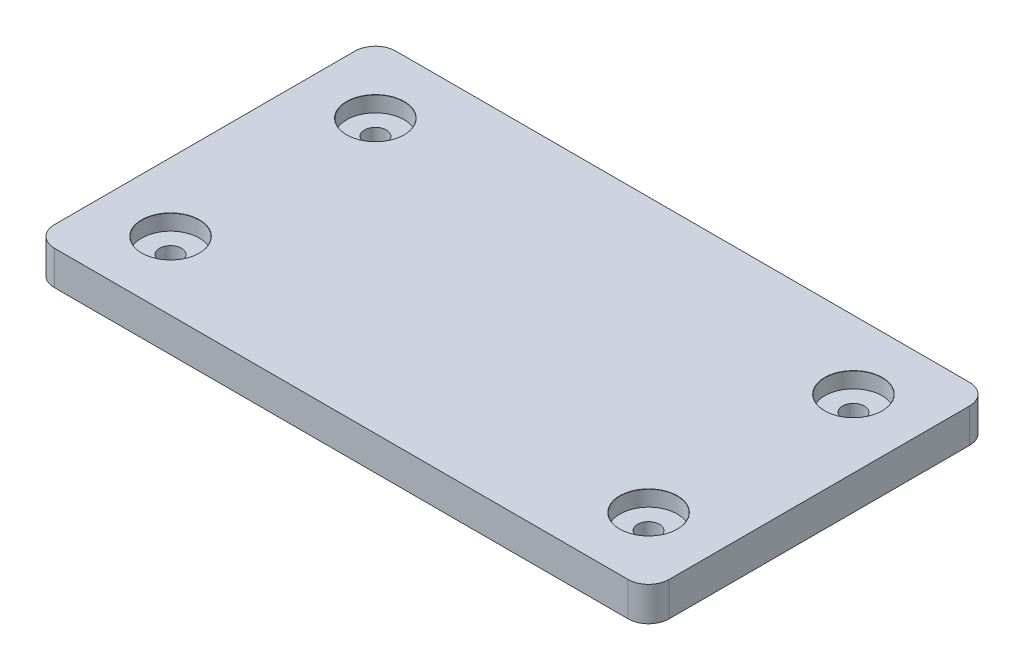
ISO-10303-21;
HEADER;
FILE_DESCRIPTION(('STEP AP214'),'2;1');
FILE_NAME('part.step','',(''),(''),'','','');
FILE_SCHEMA(('AUTOMOTIVE_DESIGN { 1 0 10303 214 1 1 1 1 }'));
ENDSEC;
DATA;
#1=APPLICATION_CONTEXT('core data for automotive mechanical design processes');
#2=APPLICATION_PROTOCOL_DEFINITION('international standard','automotive_design',2000,#1);
#3=PRODUCT_CONTEXT('',#1,'mechanical');
#4=PRODUCT('Part','Part','',(#3));
#5=PRODUCT_RELATED_PRODUCT_CATEGORY('part','',(#4));
#6=PRODUCT_DEFINITION_FORMATION('','',#4);
#7=PRODUCT_DEFINITION_CONTEXT('part definition',#1,'design');
#8=PRODUCT_DEFINITION('design','',#6,#7);
#9=PRODUCT_DEFINITION_SHAPE('','',#8);
#10=(LENGTH_UNIT() NAMED_UNIT(*) SI_UNIT(.MILLI.,.METRE.));
#11=(NAMED_UNIT(*) PLANE_ANGLE_UNIT() SI_UNIT($,.RADIAN.));
#12=(NAMED_UNIT(*) SI_UNIT($,.STERADIAN.) SOLID_ANGLE_UNIT());
#13=UNCERTAINTY_MEASURE_WITH_UNIT(LENGTH_MEASURE(1.E-05),#10,'distance_accuracy_value','');
#14=(GEOMETRIC_REPRESENTATION_CONTEXT(3) GLOBAL_UNCERTAINTY_ASSIGNED_CONTEXT((#13)) GLOBAL_UNIT_ASSIGNED_CONTEXT((#10,
#11,#12)) REPRESENTATION_CONTEXT('',''));
#15=CARTESIAN_POINT('',(0.,0.,0.));
#16=DIRECTION('',(0.,0.,1.));
#17=DIRECTION('',(1.,0.,0.));
#18=AXIS2_PLACEMENT_3D('',#15,#16,#17);
#19=CARTESIAN_POINT('',(0.,0.,0.));
#20=DIRECTION('',(0.,1.,0.));
#21=DIRECTION('',(0.,0.,1.));
#22=AXIS2_PLACEMENT_3D('',#19,#20,#21);
#23=PLANE('',#22);
#24=CARTESIAN_POINT('',(35.,0.,15.));
#25=DIRECTION('',(0.,1.,0.));
#26=DIRECTION('',(0.,0.,1.));
#27=AXIS2_PLACEMENT_3D('',#24,#25,#26);
#28=CIRCLE('',#27,1.6);
#29=CARTESIAN_POINT('',(35.,0.,16.6));
#30=VERTEX_POINT('',#29);
#31=EDGE_CURVE('E219',#30,#30,#28,.F.);
#32=ORIENTED_EDGE('',*,*,#31,.F.);
#33=EDGE_LOOP('',(#32));
#34=FACE_BOUND('',#33,.T.);
#35=CARTESIAN_POINT('',(35.,0.,-15.));
#36=DIRECTION('',(0.,1.,0.));
#37=DIRECTION('',(0.,0.,1.));
#38=AXIS2_PLACEMENT_3D('',#35,#36,#37);
#39=CIRCLE('',#38,1.6);
#40=CARTESIAN_POINT('',(35.,0.,-13.4));
#41=VERTEX_POINT('',#40);
#42=EDGE_CURVE('E189',#41,#41,#39,.F.);
#43=ORIENTED_EDGE('',*,*,#42,.F.);
#44=EDGE_LOOP('',(#43));
#45=FACE_BOUND('',#44,.T.);
#46=DIRECTION('',(-1.,0.,0.));
#47=VECTOR('',#46,1.);
#48=CARTESIAN_POINT('',(45.,0.,-25.));
#49=LINE('',#48,#47);
#50=CARTESIAN_POINT('',(42.,0.,-25.));
#51=VERTEX_POINT('',#50);
#52=CARTESIAN_POINT('',(-42.,0.,-25.));
#53=VERTEX_POINT('',#52);
#54=EDGE_CURVE('E124',#51,#53,#49,.T.);
#55=ORIENTED_EDGE('',*,*,#54,.F.);
#56=CARTESIAN_POINT('',(42.,0.,-22.));
#57=DIRECTION('',(0.,1.,0.));
#58=DIRECTION('',(0.,0.,1.));
#59=AXIS2_PLACEMENT_3D('',#56,#57,#58);
#60=CIRCLE('',#59,3.);
#61=CARTESIAN_POINT('',(45.,0.,-22.));
#62=VERTEX_POINT('',#61);
#63=EDGE_CURVE('E106',#51,#62,#60,.F.);
#64=ORIENTED_EDGE('',*,*,#63,.T.);
#65=DIRECTION('',(0.,0.,-1.));
#66=VECTOR('',#65,1.);
#67=CARTESIAN_POINT('',(45.,0.,25.));
#68=LINE('',#67,#66);
#69=CARTESIAN_POINT('',(45.,0.,22.));
#70=VERTEX_POINT('',#69);
#71=EDGE_CURVE('E136',#70,#62,#68,.T.);
#72=ORIENTED_EDGE('',*,*,#71,.F.);
#73=CARTESIAN_POINT('',(42.,0.,22.));
#74=DIRECTION('',(0.,1.,0.));
#75=DIRECTION('',(0.,0.,1.));
#76=AXIS2_PLACEMENT_3D('',#73,#74,#75);
#77=CIRCLE('',#76,3.);
#78=CARTESIAN_POINT('',(42.,0.,25.));
#79=VERTEX_POINT('',#78);
#80=EDGE_CURVE('E118',#70,#79,#77,.F.);
#81=ORIENTED_EDGE('',*,*,#80,.T.);
#82=DIRECTION('',(1.,0.,0.));
#83=VECTOR('',#82,1.);
#84=CARTESIAN_POINT('',(45.,0.,25.));
#85=LINE('',#84,#83);
#86=CARTESIAN_POINT('',(-42.,0.,25.));
#87=VERTEX_POINT('',#86);
#88=EDGE_CURVE('E142',#87,#79,#85,.T.);
#89=ORIENTED_EDGE('',*,*,#88,.F.);
#90=CARTESIAN_POINT('',(-42.,0.,22.));
#91=DIRECTION('',(0.,1.,0.));
#92=DIRECTION('',(0.,0.,1.));
#93=AXIS2_PLACEMENT_3D('',#90,#91,#92);
#94=CIRCLE('',#93,3.);
#95=CARTESIAN_POINT('',(-45.,0.,22.));
#96=VERTEX_POINT('',#95);
#97=EDGE_CURVE('E150',#87,#96,#94,.F.);
#98=ORIENTED_EDGE('',*,*,#97,.T.);
#99=DIRECTION('',(0.,0.,1.));
#100=VECTOR('',#99,1.);
#101=CARTESIAN_POINT('',(-45.,0.,25.));
#102=LINE('',#101,#100);
#103=CARTESIAN_POINT('',(-45.,0.,-22.));
#104=VERTEX_POINT('',#103);
#105=EDGE_CURVE('E183',#104,#96,#102,.T.);
#106=ORIENTED_EDGE('',*,*,#105,.F.);
#107=CARTESIAN_POINT('',(-42.,0.,-22.));
#108=DIRECTION('',(0.,1.,0.));
#109=DIRECTION('',(0.,0.,1.));
#110=AXIS2_PLACEMENT_3D('',#107,#108,#109);
#111=CIRCLE('',#110,3.);
#112=EDGE_CURVE('E129',#104,#53,#111,.F.);
#113=ORIENTED_EDGE('',*,*,#112,.T.);
#114=EDGE_LOOP('',(#55,#64,#72,#81,#89,#98,#106,#113));
#115=FACE_BOUND('',#114,.T.);
#116=CARTESIAN_POINT('',(-35.,0.,15.));
#117=DIRECTION('',(0.,1.,0.));
#118=DIRECTION('',(0.,0.,1.));
#119=AXIS2_PLACEMENT_3D('',#116,#117,#118);
#120=CIRCLE('',#119,1.6);
#121=CARTESIAN_POINT('',(-35.,0.,16.6));
#122=VERTEX_POINT('',#121);
#123=EDGE_CURVE('E237',#122,#122,#120,.F.);
#124=ORIENTED_EDGE('',*,*,#123,.F.);
#125=EDGE_LOOP('',(#124));
#126=FACE_BOUND('',#125,.T.);
#127=CARTESIAN_POINT('',(-35.,0.,-15.));
#128=DIRECTION('',(0.,1.,0.));
#129=DIRECTION('',(0.,0.,1.));
#130=AXIS2_PLACEMENT_3D('',#127,#128,#129);
#131=CIRCLE('',#130,1.6);
#132=CARTESIAN_POINT('',(-35.,0.,-13.4));
#133=VERTEX_POINT('',#132);
#134=EDGE_CURVE('E257',#133,#133,#131,.F.);
#135=ORIENTED_EDGE('',*,*,#134,.F.);
#136=EDGE_LOOP('',(#135));
#137=FACE_BOUND('',#136,.T.);
#138=ADVANCED_FACE('F39',(#34,#45,#115,#126,#137),#23,.F.);
#139=CARTESIAN_POINT('',(-45.,5.,25.));
#140=DIRECTION('',(1.,0.,0.));
#141=DIRECTION('',(0.,0.,-1.));
#142=AXIS2_PLACEMENT_3D('',#139,#140,#141);
#143=PLANE('',#142);
#144=ORIENTED_EDGE('',*,*,#105,.T.);
#145=DIRECTION('',(0.,-1.,0.));
#146=VECTOR('',#145,1.);
#147=CARTESIAN_POINT('',(-45.,5.,22.));
#148=LINE('',#147,#146);
#149=CARTESIAN_POINT('',(-45.,5.,22.));
#150=VERTEX_POINT('',#149);
#151=EDGE_CURVE('E11',#96,#150,#148,.F.);
#152=ORIENTED_EDGE('',*,*,#151,.T.);
#153=DIRECTION('',(0.,0.,1.));
#154=VECTOR('',#153,1.);
#155=CARTESIAN_POINT('',(-45.,5.,25.));
#156=LINE('',#155,#154);
#157=CARTESIAN_POINT('',(-45.,5.,-22.));
#158=VERTEX_POINT('',#157);
#159=EDGE_CURVE('E135',#158,#150,#156,.T.);
#160=ORIENTED_EDGE('',*,*,#159,.F.);
#161=DIRECTION('',(0.,-1.,0.));
#162=VECTOR('',#161,1.);
#163=CARTESIAN_POINT('',(-45.,5.,-22.));
#164=LINE('',#163,#162);
#165=EDGE_CURVE('E48',#158,#104,#164,.T.);
#166=ORIENTED_EDGE('',*,*,#165,.T.);
#167=EDGE_LOOP('',(#144,#152,#160,#166));
#168=FACE_BOUND('',#167,.T.);
#169=ADVANCED_FACE('F182',(#168),#143,.F.);
#170=CARTESIAN_POINT('',(45.,5.,25.));
#171=DIRECTION('',(0.,0.,-1.));
#172=DIRECTION('',(-1.,0.,0.));
#173=AXIS2_PLACEMENT_3D('',#170,#171,#172);
#174=PLANE('',#173);
#175=ORIENTED_EDGE('',*,*,#88,.T.);
#176=DIRECTION('',(0.,-1.,0.));
#177=VECTOR('',#176,1.);
#178=CARTESIAN_POINT('',(42.,5.,25.));
#179=LINE('',#178,#177);
#180=CARTESIAN_POINT('',(42.,5.,25.));
#181=VERTEX_POINT('',#180);
#182=EDGE_CURVE('E55',#79,#181,#179,.F.);
#183=ORIENTED_EDGE('',*,*,#182,.T.);
#184=DIRECTION('',(1.,0.,0.));
#185=VECTOR('',#184,1.);
#186=CARTESIAN_POINT('',(45.,5.,25.));
#187=LINE('',#186,#185);
#188=CARTESIAN_POINT('',(-42.,5.,25.));
#189=VERTEX_POINT('',#188);
#190=EDGE_CURVE('E140',#189,#181,#187,.T.);
#191=ORIENTED_EDGE('',*,*,#190,.F.);
#192=DIRECTION('',(0.,-1.,0.));
#193=VECTOR('',#192,1.);
#194=CARTESIAN_POINT('',(-42.,5.,25.));
#195=LINE('',#194,#193);
#196=EDGE_CURVE('E171',#189,#87,#195,.T.);
#197=ORIENTED_EDGE('',*,*,#196,.T.);
#198=EDGE_LOOP('',(#175,#183,#191,#197));
#199=FACE_BOUND('',#198,.T.);
#200=ADVANCED_FACE('F290',(#199),#174,.F.);
#201=CARTESIAN_POINT('',(45.,5.,25.));
#202=DIRECTION('',(-1.,0.,0.));
#203=DIRECTION('',(0.,0.,1.));
#204=AXIS2_PLACEMENT_3D('',#201,#202,#203);
#205=PLANE('',#204);
#206=ORIENTED_EDGE('',*,*,#71,.T.);
#207=DIRECTION('',(0.,-1.,0.));
#208=VECTOR('',#207,1.);
#209=CARTESIAN_POINT('',(45.,5.,-22.));
#210=LINE('',#209,#208);
#211=CARTESIAN_POINT('',(45.,5.,-22.));
#212=VERTEX_POINT('',#211);
#213=EDGE_CURVE('E111',#62,#212,#210,.F.);
#214=ORIENTED_EDGE('',*,*,#213,.T.);
#215=DIRECTION('',(0.,0.,-1.));
#216=VECTOR('',#215,1.);
#217=CARTESIAN_POINT('',(45.,5.,25.));
#218=LINE('',#217,#216);
#219=CARTESIAN_POINT('',(45.,5.,22.));
#220=VERTEX_POINT('',#219);
#221=EDGE_CURVE('E199',#220,#212,#218,.T.);
#222=ORIENTED_EDGE('',*,*,#221,.F.);
#223=DIRECTION('',(0.,-1.,0.));
#224=VECTOR('',#223,1.);
#225=CARTESIAN_POINT('',(45.,5.,22.));
#226=LINE('',#225,#224);
#227=EDGE_CURVE('E117',#220,#70,#226,.T.);
#228=ORIENTED_EDGE('',*,*,#227,.T.);
#229=EDGE_LOOP('',(#206,#214,#222,#228));
#230=FACE_BOUND('',#229,.T.);
#231=ADVANCED_FACE('F300',(#230),#205,.F.);
#232=CARTESIAN_POINT('',(45.,5.,-25.));
#233=DIRECTION('',(0.,0.,1.));
#234=DIRECTION('',(1.,0.,0.));
#235=AXIS2_PLACEMENT_3D('',#232,#233,#234);
#236=PLANE('',#235);
#237=DIRECTION('',(-1.,0.,0.));
#238=VECTOR('',#237,1.);
#239=CARTESIAN_POINT('',(45.,5.,-25.));
#240=LINE('',#239,#238);
#241=CARTESIAN_POINT('',(42.,5.,-25.));
#242=VERTEX_POINT('',#241);
#243=CARTESIAN_POINT('',(-42.,5.,-25.));
#244=VERTEX_POINT('',#243);
#245=EDGE_CURVE('E127',#242,#244,#240,.T.);
#246=ORIENTED_EDGE('',*,*,#245,.F.);
#247=DIRECTION('',(0.,-1.,0.));
#248=VECTOR('',#247,1.);
#249=CARTESIAN_POINT('',(42.,5.,-25.));
#250=LINE('',#249,#248);
#251=EDGE_CURVE('E110',#242,#51,#250,.T.);
#252=ORIENTED_EDGE('',*,*,#251,.T.);
#253=ORIENTED_EDGE('',*,*,#54,.T.);
#254=DIRECTION('',(0.,-1.,0.));
#255=VECTOR('',#254,1.);
#256=CARTESIAN_POINT('',(-42.,5.,-25.));
#257=LINE('',#256,#255);
#258=EDGE_CURVE('E130',#53,#244,#257,.F.);
#259=ORIENTED_EDGE('',*,*,#258,.T.);
#260=EDGE_LOOP('',(#246,#252,#253,#259));
#261=FACE_BOUND('',#260,.T.);
#262=ADVANCED_FACE('F123',(#261),#236,.F.);
#263=CARTESIAN_POINT('',(0.,5.,0.));
#264=DIRECTION('',(0.,1.,0.));
#265=DIRECTION('',(0.,0.,1.));
#266=AXIS2_PLACEMENT_3D('',#263,#264,#265);
#267=PLANE('',#266);
#268=CARTESIAN_POINT('',(-35.,5.,-15.));
#269=DIRECTION('',(0.,1.,0.));
#270=DIRECTION('',(0.,0.,1.));
#271=AXIS2_PLACEMENT_3D('',#268,#269,#270);
#272=CIRCLE('',#271,4.225);
#273=CARTESIAN_POINT('',(-35.,5.,-10.775));
#274=VERTEX_POINT('',#273);
#275=EDGE_CURVE('E273',#274,#274,#272,.T.);
#276=ORIENTED_EDGE('',*,*,#275,.F.);
#277=EDGE_LOOP('',(#276));
#278=FACE_BOUND('',#277,.T.);
#279=CARTESIAN_POINT('',(-35.,5.,15.));
#280=DIRECTION('',(0.,1.,0.));
#281=DIRECTION('',(0.,0.,1.));
#282=AXIS2_PLACEMENT_3D('',#279,#280,#281);
#283=CIRCLE('',#282,4.225);
#284=CARTESIAN_POINT('',(-35.,5.,19.225));
#285=VERTEX_POINT('',#284);
#286=EDGE_CURVE('E253',#285,#285,#283,.T.);
#287=ORIENTED_EDGE('',*,*,#286,.F.);
#288=EDGE_LOOP('',(#287));
#289=FACE_BOUND('',#288,.T.);
#290=CARTESIAN_POINT('',(35.,5.,15.));
#291=DIRECTION('',(0.,1.,0.));
#292=DIRECTION('',(0.,0.,1.));
#293=AXIS2_PLACEMENT_3D('',#290,#291,#292);
#294=CIRCLE('',#293,4.225);
#295=CARTESIAN_POINT('',(35.,5.,19.225));
#296=VERTEX_POINT('',#295);
#297=EDGE_CURVE('E233',#296,#296,#294,.T.);
#298=ORIENTED_EDGE('',*,*,#297,.F.);
#299=EDGE_LOOP('',(#298));
#300=FACE_BOUND('',#299,.T.);
#301=CARTESIAN_POINT('',(35.,5.,-15.));
#302=DIRECTION('',(0.,1.,0.));
#303=DIRECTION('',(0.,0.,1.));
#304=AXIS2_PLACEMENT_3D('',#301,#302,#303);
#305=CIRCLE('',#304,4.225);
#306=CARTESIAN_POINT('',(35.,5.,-10.775));
#307=VERTEX_POINT('',#306);
#308=EDGE_CURVE('E216',#307,#307,#305,.T.);
#309=ORIENTED_EDGE('',*,*,#308,.F.);
#310=EDGE_LOOP('',(#309));
#311=FACE_BOUND('',#310,.T.);
#312=ORIENTED_EDGE('',*,*,#221,.T.);
#313=CARTESIAN_POINT('',(42.,5.,-22.));
#314=DIRECTION('',(0.,1.,0.));
#315=DIRECTION('',(0.,0.,1.));
#316=AXIS2_PLACEMENT_3D('',#313,#314,#315);
#317=CIRCLE('',#316,3.);
#318=EDGE_CURVE('E168',#212,#242,#317,.T.);
#319=ORIENTED_EDGE('',*,*,#318,.T.);
#320=ORIENTED_EDGE('',*,*,#245,.T.);
#321=CARTESIAN_POINT('',(-42.,5.,-22.));
#322=DIRECTION('',(0.,1.,0.));
#323=DIRECTION('',(0.,0.,1.));
#324=AXIS2_PLACEMENT_3D('',#321,#322,#323);
#325=CIRCLE('',#324,3.);
#326=EDGE_CURVE('E160',#244,#158,#325,.T.);
#327=ORIENTED_EDGE('',*,*,#326,.T.);
#328=ORIENTED_EDGE('',*,*,#159,.T.);
#329=CARTESIAN_POINT('',(-42.,5.,22.));
#330=DIRECTION('',(0.,1.,0.));
#331=DIRECTION('',(0.,0.,1.));
#332=AXIS2_PLACEMENT_3D('',#329,#330,#331);
#333=CIRCLE('',#332,3.);
#334=EDGE_CURVE('E62',#150,#189,#333,.T.);
#335=ORIENTED_EDGE('',*,*,#334,.T.);
#336=ORIENTED_EDGE('',*,*,#190,.T.);
#337=CARTESIAN_POINT('',(42.,5.,22.));
#338=DIRECTION('',(0.,1.,0.));
#339=DIRECTION('',(0.,0.,1.));
#340=AXIS2_PLACEMENT_3D('',#337,#338,#339);
#341=CIRCLE('',#340,3.);
#342=EDGE_CURVE('E165',#181,#220,#341,.T.);
#343=ORIENTED_EDGE('',*,*,#342,.T.);
#344=EDGE_LOOP('',(#312,#319,#320,#327,#328,#335,#336,#343));
#345=FACE_BOUND('',#344,.T.);
#346=ADVANCED_FACE('F296',(#278,#289,#300,#311,#345),#267,.T.);
#347=CARTESIAN_POINT('',(42.,5.,-22.));
#348=DIRECTION('',(0.,-1.,0.));
#349=DIRECTION('',(0.,0.,-1.));
#350=AXIS2_PLACEMENT_3D('',#347,#348,#349);
#351=CYLINDRICAL_SURFACE('',#350,3.);
#352=ORIENTED_EDGE('',*,*,#318,.F.);
#353=ORIENTED_EDGE('',*,*,#213,.F.);
#354=ORIENTED_EDGE('',*,*,#63,.F.);
#355=ORIENTED_EDGE('',*,*,#251,.F.);
#356=EDGE_LOOP('',(#352,#353,#354,#355));
#357=FACE_BOUND('',#356,.T.);
#358=ADVANCED_FACE('F109',(#357),#351,.T.);
#359=CARTESIAN_POINT('',(42.,5.,22.));
#360=DIRECTION('',(0.,-1.,0.));
#361=DIRECTION('',(0.,0.,-1.));
#362=AXIS2_PLACEMENT_3D('',#359,#360,#361);
#363=CYLINDRICAL_SURFACE('',#362,3.);
#364=ORIENTED_EDGE('',*,*,#342,.F.);
#365=ORIENTED_EDGE('',*,*,#182,.F.);
#366=ORIENTED_EDGE('',*,*,#80,.F.);
#367=ORIENTED_EDGE('',*,*,#227,.F.);
#368=EDGE_LOOP('',(#364,#365,#366,#367));
#369=FACE_BOUND('',#368,.T.);
#370=ADVANCED_FACE('F308',(#369),#363,.T.);
#371=CARTESIAN_POINT('',(-42.,5.,22.));
#372=DIRECTION('',(0.,-1.,0.));
#373=DIRECTION('',(0.,0.,-1.));
#374=AXIS2_PLACEMENT_3D('',#371,#372,#373);
#375=CYLINDRICAL_SURFACE('',#374,3.);
#376=ORIENTED_EDGE('',*,*,#334,.F.);
#377=ORIENTED_EDGE('',*,*,#151,.F.);
#378=ORIENTED_EDGE('',*,*,#97,.F.);
#379=ORIENTED_EDGE('',*,*,#196,.F.);
#380=EDGE_LOOP('',(#376,#377,#378,#379));
#381=FACE_BOUND('',#380,.T.);
#382=ADVANCED_FACE('F310',(#381),#375,.T.);
#383=CARTESIAN_POINT('',(-42.,5.,-22.));
#384=DIRECTION('',(0.,-1.,0.));
#385=DIRECTION('',(0.,0.,-1.));
#386=AXIS2_PLACEMENT_3D('',#383,#384,#385);
#387=CYLINDRICAL_SURFACE('',#386,3.);
#388=ORIENTED_EDGE('',*,*,#326,.F.);
#389=ORIENTED_EDGE('',*,*,#258,.F.);
#390=ORIENTED_EDGE('',*,*,#112,.F.);
#391=ORIENTED_EDGE('',*,*,#165,.F.);
#392=EDGE_LOOP('',(#388,#389,#390,#391));
#393=FACE_BOUND('',#392,.T.);
#394=ADVANCED_FACE('F41',(#393),#387,.T.);
#395=CARTESIAN_POINT('',(35.,5.,-15.));
#396=DIRECTION('',(0.,1.,0.));
#397=DIRECTION('',(0.,0.,1.));
#398=AXIS2_PLACEMENT_3D('',#395,#396,#397);
#399=CYLINDRICAL_SURFACE('',#398,1.6);
#400=ORIENTED_EDGE('',*,*,#42,.T.);
#401=EDGE_LOOP('',(#400));
#402=FACE_BOUND('',#401,.T.);
#403=CARTESIAN_POINT('',(35.,2.7,-15.));
#404=DIRECTION('',(0.,1.,0.));
#405=DIRECTION('',(0.,0.,1.));
#406=AXIS2_PLACEMENT_3D('',#403,#404,#405);
#407=CIRCLE('',#406,1.6);
#408=CARTESIAN_POINT('',(35.,2.7,-13.4));
#409=VERTEX_POINT('',#408);
#410=EDGE_CURVE('E194',#409,#409,#407,.T.);
#411=ORIENTED_EDGE('',*,*,#410,.T.);
#412=EDGE_LOOP('',(#411));
#413=FACE_BOUND('',#412,.T.);
#414=ADVANCED_FACE('F317',(#402,#413),#399,.F.);
#415=CARTESIAN_POINT('',(36.6,2.7,-15.));
#416=DIRECTION('',(0.,-1.,0.));
#417=DIRECTION('',(0.,0.,-1.));
#418=AXIS2_PLACEMENT_3D('',#415,#416,#417);
#419=PLANE('',#418);
#420=ORIENTED_EDGE('',*,*,#410,.F.);
#421=EDGE_LOOP('',(#420));
#422=FACE_BOUND('',#421,.T.);
#423=CARTESIAN_POINT('',(35.,2.7,-15.));
#424=DIRECTION('',(0.,1.,0.));
#425=DIRECTION('',(0.,0.,1.));
#426=AXIS2_PLACEMENT_3D('',#423,#424,#425);
#427=CIRCLE('',#426,4.2);
#428=CARTESIAN_POINT('',(35.,2.7,-10.8));
#429=VERTEX_POINT('',#428);
#430=EDGE_CURVE('E208',#429,#429,#427,.T.);
#431=ORIENTED_EDGE('',*,*,#430,.T.);
#432=EDGE_LOOP('',(#431));
#433=FACE_BOUND('',#432,.T.);
#434=ADVANCED_FACE('F347',(#422,#433),#419,.F.);
#435=CARTESIAN_POINT('',(35.,5.,-15.));
#436=DIRECTION('',(0.,1.,0.));
#437=DIRECTION('',(0.,0.,1.));
#438=AXIS2_PLACEMENT_3D('',#435,#436,#437);
#439=CYLINDRICAL_SURFACE('',#438,4.2);
#440=ORIENTED_EDGE('',*,*,#430,.F.);
#441=EDGE_LOOP('',(#440));
#442=FACE_BOUND('',#441,.T.);
#443=CARTESIAN_POINT('',(35.,4.97500000000001,-15.));
#444=DIRECTION('',(0.,1.,0.));
#445=DIRECTION('',(0.,0.,1.));
#446=AXIS2_PLACEMENT_3D('',#443,#444,#445);
#447=CIRCLE('',#446,4.2);
#448=CARTESIAN_POINT('',(35.,4.97500000000001,-10.8));
#449=VERTEX_POINT('',#448);
#450=EDGE_CURVE('E212',#449,#449,#447,.T.);
#451=ORIENTED_EDGE('',*,*,#450,.T.);
#452=EDGE_LOOP('',(#451));
#453=FACE_BOUND('',#452,.T.);
#454=ADVANCED_FACE('F337',(#442,#453),#439,.F.);
#455=CARTESIAN_POINT('',(35.,5.,-15.));
#456=DIRECTION('',(0.,1.,0.));
#457=DIRECTION('',(0.,0.,1.));
#458=AXIS2_PLACEMENT_3D('',#455,#456,#457);
#459=CONICAL_SURFACE('',#458,4.225,0.785398163397604);
#460=ORIENTED_EDGE('',*,*,#450,.F.);
#461=EDGE_LOOP('',(#460));
#462=FACE_BOUND('',#461,.T.);
#463=ORIENTED_EDGE('',*,*,#308,.T.);
#464=EDGE_LOOP('',(#463));
#465=FACE_BOUND('',#464,.T.);
#466=ADVANCED_FACE('F334',(#462,#465),#459,.F.);
#467=CARTESIAN_POINT('',(35.,5.,15.));
#468=DIRECTION('',(0.,1.,0.));
#469=DIRECTION('',(0.,0.,1.));
#470=AXIS2_PLACEMENT_3D('',#467,#468,#469);
#471=CYLINDRICAL_SURFACE('',#470,1.6);
#472=ORIENTED_EDGE('',*,*,#31,.T.);
#473=EDGE_LOOP('',(#472));
#474=FACE_BOUND('',#473,.T.);
#475=CARTESIAN_POINT('',(35.,2.7,15.));
#476=DIRECTION('',(0.,1.,0.));
#477=DIRECTION('',(0.,0.,1.));
#478=AXIS2_PLACEMENT_3D('',#475,#476,#477);
#479=CIRCLE('',#478,1.6);
#480=CARTESIAN_POINT('',(35.,2.7,16.6));
#481=VERTEX_POINT('',#480);
#482=EDGE_CURVE('E221',#481,#481,#479,.T.);
#483=ORIENTED_EDGE('',*,*,#482,.T.);
#484=EDGE_LOOP('',(#483));
#485=FACE_BOUND('',#484,.T.);
#486=ADVANCED_FACE('F336',(#474,#485),#471,.F.);
#487=CARTESIAN_POINT('',(36.6,2.7,15.));
#488=DIRECTION('',(0.,-1.,0.));
#489=DIRECTION('',(0.,0.,-1.));
#490=AXIS2_PLACEMENT_3D('',#487,#488,#489);
#491=PLANE('',#490);
#492=ORIENTED_EDGE('',*,*,#482,.F.);
#493=EDGE_LOOP('',(#492));
#494=FACE_BOUND('',#493,.T.);
#495=CARTESIAN_POINT('',(35.,2.7,15.));
#496=DIRECTION('',(0.,1.,0.));
#497=DIRECTION('',(0.,0.,1.));
#498=AXIS2_PLACEMENT_3D('',#495,#496,#497);
#499=CIRCLE('',#498,4.2);
#500=CARTESIAN_POINT('',(35.,2.7,19.2));
#501=VERTEX_POINT('',#500);
#502=EDGE_CURVE('E225',#501,#501,#499,.T.);
#503=ORIENTED_EDGE('',*,*,#502,.T.);
#504=EDGE_LOOP('',(#503));
#505=FACE_BOUND('',#504,.T.);
#506=ADVANCED_FACE('F344',(#494,#505),#491,.F.);
#507=CARTESIAN_POINT('',(35.,5.,15.));
#508=DIRECTION('',(0.,1.,0.));
#509=DIRECTION('',(0.,0.,1.));
#510=AXIS2_PLACEMENT_3D('',#507,#508,#509);
#511=CYLINDRICAL_SURFACE('',#510,4.2);
#512=ORIENTED_EDGE('',*,*,#502,.F.);
#513=EDGE_LOOP('',(#512));
#514=FACE_BOUND('',#513,.T.);
#515=CARTESIAN_POINT('',(35.,4.97500000000001,15.));
#516=DIRECTION('',(0.,1.,0.));
#517=DIRECTION('',(0.,0.,1.));
#518=AXIS2_PLACEMENT_3D('',#515,#516,#517);
#519=CIRCLE('',#518,4.2);
#520=CARTESIAN_POINT('',(35.,4.97500000000001,19.2));
#521=VERTEX_POINT('',#520);
#522=EDGE_CURVE('E229',#521,#521,#519,.T.);
#523=ORIENTED_EDGE('',*,*,#522,.T.);
#524=EDGE_LOOP('',(#523));
#525=FACE_BOUND('',#524,.T.);
#526=ADVANCED_FACE('F394',(#514,#525),#511,.F.);
#527=CARTESIAN_POINT('',(35.,5.,15.));
#528=DIRECTION('',(0.,1.,0.));
#529=DIRECTION('',(0.,0.,1.));
#530=AXIS2_PLACEMENT_3D('',#527,#528,#529);
#531=CONICAL_SURFACE('',#530,4.225,0.785398163397604);
#532=ORIENTED_EDGE('',*,*,#522,.F.);
#533=EDGE_LOOP('',(#532));
#534=FACE_BOUND('',#533,.T.);
#535=ORIENTED_EDGE('',*,*,#297,.T.);
#536=EDGE_LOOP('',(#535));
#537=FACE_BOUND('',#536,.T.);
#538=ADVANCED_FACE('F403',(#534,#537),#531,.F.);
#539=CARTESIAN_POINT('',(-35.,5.,15.));
#540=DIRECTION('',(0.,1.,0.));
#541=DIRECTION('',(0.,0.,1.));
#542=AXIS2_PLACEMENT_3D('',#539,#540,#541);
#543=CYLINDRICAL_SURFACE('',#542,1.6);
#544=ORIENTED_EDGE('',*,*,#123,.T.);
#545=EDGE_LOOP('',(#544));
#546=FACE_BOUND('',#545,.T.);
#547=CARTESIAN_POINT('',(-35.,2.7,15.));
#548=DIRECTION('',(0.,1.,0.));
#549=DIRECTION('',(0.,0.,1.));
#550=AXIS2_PLACEMENT_3D('',#547,#548,#549);
#551=CIRCLE('',#550,1.6);
#552=CARTESIAN_POINT('',(-35.,2.7,16.6));
#553=VERTEX_POINT('',#552);
#554=EDGE_CURVE('E241',#553,#553,#551,.T.);
#555=ORIENTED_EDGE('',*,*,#554,.T.);
#556=EDGE_LOOP('',(#555));
#557=FACE_BOUND('',#556,.T.);
#558=ADVANCED_FACE('F413',(#546,#557),#543,.F.);
#559=CARTESIAN_POINT('',(-33.4,2.7,15.));
#560=DIRECTION('',(0.,-1.,0.));
#561=DIRECTION('',(0.,0.,-1.));
#562=AXIS2_PLACEMENT_3D('',#559,#560,#561);
#563=PLANE('',#562);
#564=ORIENTED_EDGE('',*,*,#554,.F.);
#565=EDGE_LOOP('',(#564));
#566=FACE_BOUND('',#565,.T.);
#567=CARTESIAN_POINT('',(-35.,2.7,15.));
#568=DIRECTION('',(0.,1.,0.));
#569=DIRECTION('',(0.,0.,1.));
#570=AXIS2_PLACEMENT_3D('',#567,#568,#569);
#571=CIRCLE('',#570,4.2);
#572=CARTESIAN_POINT('',(-35.,2.7,19.2));
#573=VERTEX_POINT('',#572);
#574=EDGE_CURVE('E245',#573,#573,#571,.T.);
#575=ORIENTED_EDGE('',*,*,#574,.T.);
#576=EDGE_LOOP('',(#575));
#577=FACE_BOUND('',#576,.T.);
#578=ADVANCED_FACE('F423',(#566,#577),#563,.F.);
#579=CARTESIAN_POINT('',(-35.,5.,15.));
#580=DIRECTION('',(0.,1.,0.));
#581=DIRECTION('',(0.,0.,1.));
#582=AXIS2_PLACEMENT_3D('',#579,#580,#581);
#583=CYLINDRICAL_SURFACE('',#582,4.2);
#584=ORIENTED_EDGE('',*,*,#574,.F.);
#585=EDGE_LOOP('',(#584));
#586=FACE_BOUND('',#585,.T.);
#587=CARTESIAN_POINT('',(-35.,4.97500000000001,15.));
#588=DIRECTION('',(0.,1.,0.));
#589=DIRECTION('',(0.,0.,1.));
#590=AXIS2_PLACEMENT_3D('',#587,#588,#589);
#591=CIRCLE('',#590,4.2);
#592=CARTESIAN_POINT('',(-35.,4.97500000000001,19.2));
#593=VERTEX_POINT('',#592);
#594=EDGE_CURVE('E249',#593,#593,#591,.T.);
#595=ORIENTED_EDGE('',*,*,#594,.T.);
#596=EDGE_LOOP('',(#595));
#597=FACE_BOUND('',#596,.T.);
#598=ADVANCED_FACE('F433',(#586,#597),#583,.F.);
#599=CARTESIAN_POINT('',(-35.,5.,15.));
#600=DIRECTION('',(0.,1.,0.));
#601=DIRECTION('',(0.,0.,1.));
#602=AXIS2_PLACEMENT_3D('',#599,#600,#601);
#603=CONICAL_SURFACE('',#602,4.225,0.785398163397535);
#604=ORIENTED_EDGE('',*,*,#594,.F.);
#605=EDGE_LOOP('',(#604));
#606=FACE_BOUND('',#605,.T.);
#607=ORIENTED_EDGE('',*,*,#286,.T.);
#608=EDGE_LOOP('',(#607));
#609=FACE_BOUND('',#608,.T.);
#610=ADVANCED_FACE('F443',(#606,#609),#603,.F.);
#611=CARTESIAN_POINT('',(-35.,5.,-15.));
#612=DIRECTION('',(0.,1.,0.));
#613=DIRECTION('',(0.,0.,1.));
#614=AXIS2_PLACEMENT_3D('',#611,#612,#613);
#615=CYLINDRICAL_SURFACE('',#614,1.6);
#616=ORIENTED_EDGE('',*,*,#134,.T.);
#617=EDGE_LOOP('',(#616));
#618=FACE_BOUND('',#617,.T.);
#619=CARTESIAN_POINT('',(-35.,2.7,-15.));
#620=DIRECTION('',(0.,1.,0.));
#621=DIRECTION('',(0.,0.,1.));
#622=AXIS2_PLACEMENT_3D('',#619,#620,#621);
#623=CIRCLE('',#622,1.6);
#624=CARTESIAN_POINT('',(-35.,2.7,-13.4));
#625=VERTEX_POINT('',#624);
#626=EDGE_CURVE('E261',#625,#625,#623,.T.);
#627=ORIENTED_EDGE('',*,*,#626,.T.);
#628=EDGE_LOOP('',(#627));
#629=FACE_BOUND('',#628,.T.);
#630=ADVANCED_FACE('F281',(#618,#629),#615,.F.);
#631=CARTESIAN_POINT('',(-33.4,2.7,-15.));
#632=DIRECTION('',(0.,-1.,0.));
#633=DIRECTION('',(0.,0.,-1.));
#634=AXIS2_PLACEMENT_3D('',#631,#632,#633);
#635=PLANE('',#634);
#636=ORIENTED_EDGE('',*,*,#626,.F.);
#637=EDGE_LOOP('',(#636));
#638=FACE_BOUND('',#637,.T.);
#639=CARTESIAN_POINT('',(-35.,2.7,-15.));
#640=DIRECTION('',(0.,1.,0.));
#641=DIRECTION('',(0.,0.,1.));
#642=AXIS2_PLACEMENT_3D('',#639,#640,#641);
#643=CIRCLE('',#642,4.2);
#644=CARTESIAN_POINT('',(-35.,2.7,-10.8));
#645=VERTEX_POINT('',#644);
#646=EDGE_CURVE('E265',#645,#645,#643,.T.);
#647=ORIENTED_EDGE('',*,*,#646,.T.);
#648=EDGE_LOOP('',(#647));
#649=FACE_BOUND('',#648,.T.);
#650=ADVANCED_FACE('F462',(#638,#649),#635,.F.);
#651=CARTESIAN_POINT('',(-35.,5.,-15.));
#652=DIRECTION('',(0.,1.,0.));
#653=DIRECTION('',(0.,0.,1.));
#654=AXIS2_PLACEMENT_3D('',#651,#652,#653);
#655=CYLINDRICAL_SURFACE('',#654,4.2);
#656=ORIENTED_EDGE('',*,*,#646,.F.);
#657=EDGE_LOOP('',(#656));
#658=FACE_BOUND('',#657,.T.);
#659=CARTESIAN_POINT('',(-35.,4.97500000000001,-15.));
#660=DIRECTION('',(0.,1.,0.));
#661=DIRECTION('',(0.,0.,1.));
#662=AXIS2_PLACEMENT_3D('',#659,#660,#661);
#663=CIRCLE('',#662,4.2);
#664=CARTESIAN_POINT('',(-35.,4.97500000000001,-10.8));
#665=VERTEX_POINT('',#664);
#666=EDGE_CURVE('E269',#665,#665,#663,.T.);
#667=ORIENTED_EDGE('',*,*,#666,.T.);
#668=EDGE_LOOP('',(#667));
#669=FACE_BOUND('',#668,.T.);
#670=ADVANCED_FACE('F471',(#658,#669),#655,.F.);
#671=CARTESIAN_POINT('',(-35.,5.,-15.));
#672=DIRECTION('',(0.,1.,0.));
#673=DIRECTION('',(0.,0.,1.));
#674=AXIS2_PLACEMENT_3D('',#671,#672,#673);
#675=CONICAL_SURFACE('',#674,4.225,0.785398163397535);
#676=ORIENTED_EDGE('',*,*,#666,.F.);
#677=EDGE_LOOP('',(#676));
#678=FACE_BOUND('',#677,.T.);
#679=ORIENTED_EDGE('',*,*,#275,.T.);
#680=EDGE_LOOP('',(#679));
#681=FACE_BOUND('',#680,.T.);
#682=ADVANCED_FACE('F481',(#678,#681),#675,.F.);
#683=CLOSED_SHELL('',(#138,#169,#200,#231,#262,#346,#358,#370,#382,#394,#414,#434,#454,#466,
#486,#506,#526,#538,#558,#578,#598,#610,#630,#650,#670,#682));
#684=MANIFOLD_SOLID_BREP('B2',#683);
#685=ADVANCED_BREP_SHAPE_REPRESENTATION('',(#18,#684),#14);
#686=SHAPE_DEFINITION_REPRESENTATION(#9,#685);
ENDSEC;
END-ISO-10303-21;
